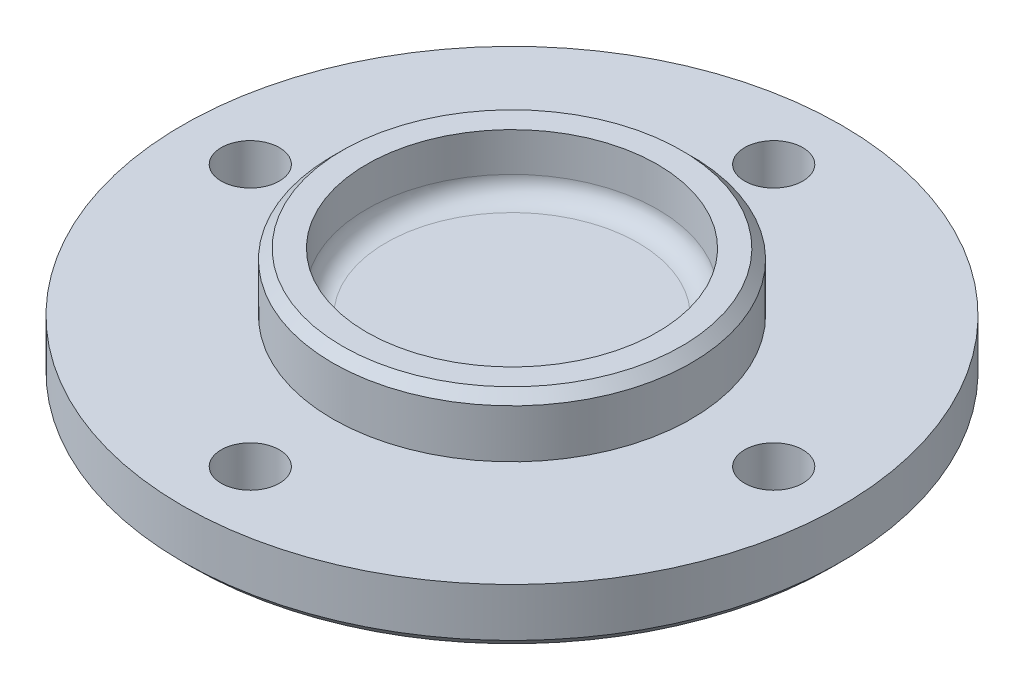
ISO-10303-21;
HEADER;
FILE_DESCRIPTION(('STEP AP214'),'2;1');
FILE_NAME('part.step','',(''),(''),'','','');
FILE_SCHEMA(('AUTOMOTIVE_DESIGN { 1 0 10303 214 1 1 1 1 }'));
ENDSEC;
DATA;
#1=APPLICATION_CONTEXT('core data for automotive mechanical design processes');
#2=APPLICATION_PROTOCOL_DEFINITION('international standard','automotive_design',2000,#1);
#3=PRODUCT_CONTEXT('',#1,'mechanical');
#4=PRODUCT('Part','Part','',(#3));
#5=PRODUCT_RELATED_PRODUCT_CATEGORY('part','',(#4));
#6=PRODUCT_DEFINITION_FORMATION('','',#4);
#7=PRODUCT_DEFINITION_CONTEXT('part definition',#1,'design');
#8=PRODUCT_DEFINITION('design','',#6,#7);
#9=PRODUCT_DEFINITION_SHAPE('','',#8);
#10=(LENGTH_UNIT() NAMED_UNIT(*) SI_UNIT(.MILLI.,.METRE.));
#11=(NAMED_UNIT(*) PLANE_ANGLE_UNIT() SI_UNIT($,.RADIAN.));
#12=(NAMED_UNIT(*) SI_UNIT($,.STERADIAN.) SOLID_ANGLE_UNIT());
#13=UNCERTAINTY_MEASURE_WITH_UNIT(LENGTH_MEASURE(1.E-05),#10,'distance_accuracy_value','');
#14=(GEOMETRIC_REPRESENTATION_CONTEXT(3) GLOBAL_UNCERTAINTY_ASSIGNED_CONTEXT((#13)) GLOBAL_UNIT_ASSIGNED_CONTEXT((#10,
#11,#12)) REPRESENTATION_CONTEXT('',''));
#15=CARTESIAN_POINT('',(0.,0.,0.));
#16=DIRECTION('',(0.,0.,1.));
#17=DIRECTION('',(1.,0.,0.));
#18=AXIS2_PLACEMENT_3D('',#15,#16,#17);
#19=CARTESIAN_POINT('',(0.,0.,0.));
#20=DIRECTION('',(0.,1.,0.));
#21=DIRECTION('',(0.,0.,1.));
#22=AXIS2_PLACEMENT_3D('',#19,#20,#21);
#23=PLANE('',#22);
#24=CARTESIAN_POINT('',(0.,0.,0.));
#25=DIRECTION('',(0.,1.,0.));
#26=DIRECTION('',(0.,0.,1.));
#27=AXIS2_PLACEMENT_3D('',#24,#25,#26);
#28=CIRCLE('',#27,33.);
#29=CARTESIAN_POINT('',(0.,0.,33.));
#30=VERTEX_POINT('',#29);
#31=EDGE_CURVE('E65',#30,#30,#28,.F.);
#32=ORIENTED_EDGE('',*,*,#31,.T.);
#33=EDGE_LOOP('',(#32));
#34=FACE_BOUND('',#33,.T.);
#35=CARTESIAN_POINT('',(27.,0.,0.));
#36=DIRECTION('',(0.,1.,0.));
#37=DIRECTION('',(-1.,0.,0.));
#38=AXIS2_PLACEMENT_3D('',#35,#36,#37);
#39=CIRCLE('',#38,3.);
#40=CARTESIAN_POINT('',(24.,0.,0.));
#41=VERTEX_POINT('',#40);
#42=EDGE_CURVE('E101',#41,#41,#39,.T.);
#43=ORIENTED_EDGE('',*,*,#42,.T.);
#44=EDGE_LOOP('',(#43));
#45=FACE_BOUND('',#44,.T.);
#46=CARTESIAN_POINT('',(0.,0.,27.));
#47=DIRECTION('',(0.,1.,0.));
#48=DIRECTION('',(0.,0.,-1.));
#49=AXIS2_PLACEMENT_3D('',#46,#47,#48);
#50=CIRCLE('',#49,3.);
#51=CARTESIAN_POINT('',(0.,0.,24.));
#52=VERTEX_POINT('',#51);
#53=EDGE_CURVE('E117',#52,#52,#50,.T.);
#54=ORIENTED_EDGE('',*,*,#53,.T.);
#55=EDGE_LOOP('',(#54));
#56=FACE_BOUND('',#55,.T.);
#57=CARTESIAN_POINT('',(-27.,0.,-2.82809988446294E-13));
#58=DIRECTION('',(0.,1.,0.));
#59=DIRECTION('',(1.,0.,0.));
#60=AXIS2_PLACEMENT_3D('',#57,#58,#59);
#61=CIRCLE('',#60,3.);
#62=CARTESIAN_POINT('',(-24.,0.,-2.51386656396706E-13));
#63=VERTEX_POINT('',#62);
#64=EDGE_CURVE('E109',#63,#63,#61,.T.);
#65=ORIENTED_EDGE('',*,*,#64,.T.);
#66=EDGE_LOOP('',(#65));
#67=FACE_BOUND('',#66,.T.);
#68=CARTESIAN_POINT('',(0.,0.,-27.));
#69=DIRECTION('',(0.,1.,0.));
#70=DIRECTION('',(0.,0.,1.));
#71=AXIS2_PLACEMENT_3D('',#68,#69,#70);
#72=CIRCLE('',#71,3.);
#73=CARTESIAN_POINT('',(0.,0.,-24.));
#74=VERTEX_POINT('',#73);
#75=EDGE_CURVE('E96',#74,#74,#72,.T.);
#76=ORIENTED_EDGE('',*,*,#75,.T.);
#77=EDGE_LOOP('',(#76));
#78=FACE_BOUND('',#77,.T.);
#79=ADVANCED_FACE('F51',(#34,#45,#56,#67,#78),#23,.F.);
#80=CARTESIAN_POINT('',(0.,6.,0.));
#81=DIRECTION('',(0.,-1.,0.));
#82=DIRECTION('',(0.,0.,-1.));
#83=AXIS2_PLACEMENT_3D('',#80,#81,#82);
#84=CYLINDRICAL_SURFACE('',#83,34.);
#85=CARTESIAN_POINT('',(0.,1.00000000000001,0.));
#86=DIRECTION('',(0.,1.,0.));
#87=DIRECTION('',(0.,0.,1.));
#88=AXIS2_PLACEMENT_3D('',#85,#86,#87);
#89=CIRCLE('',#88,34.);
#90=CARTESIAN_POINT('',(0.,1.00000000000001,34.));
#91=VERTEX_POINT('',#90);
#92=EDGE_CURVE('E70',#91,#91,#89,.T.);
#93=ORIENTED_EDGE('',*,*,#92,.T.);
#94=EDGE_LOOP('',(#93));
#95=FACE_BOUND('',#94,.T.);
#96=CARTESIAN_POINT('',(0.,6.,0.));
#97=DIRECTION('',(0.,1.,0.));
#98=DIRECTION('',(0.,0.,1.));
#99=AXIS2_PLACEMENT_3D('',#96,#97,#98);
#100=CIRCLE('',#99,34.);
#101=CARTESIAN_POINT('',(0.,6.,34.));
#102=VERTEX_POINT('',#101);
#103=EDGE_CURVE('E84',#102,#102,#100,.T.);
#104=ORIENTED_EDGE('',*,*,#103,.F.);
#105=EDGE_LOOP('',(#104));
#106=FACE_BOUND('',#105,.T.);
#107=ADVANCED_FACE('F143',(#95,#106),#84,.T.);
#108=CARTESIAN_POINT('',(0.,6.,0.));
#109=DIRECTION('',(0.,1.,0.));
#110=DIRECTION('',(0.,0.,1.));
#111=AXIS2_PLACEMENT_3D('',#108,#109,#110);
#112=PLANE('',#111);
#113=CARTESIAN_POINT('',(27.,6.,0.));
#114=DIRECTION('',(0.,1.,0.));
#115=DIRECTION('',(-1.,0.,0.));
#116=AXIS2_PLACEMENT_3D('',#113,#114,#115);
#117=CIRCLE('',#116,3.);
#118=CARTESIAN_POINT('',(24.,6.,0.));
#119=VERTEX_POINT('',#118);
#120=EDGE_CURVE('E121',#119,#119,#117,.T.);
#121=ORIENTED_EDGE('',*,*,#120,.F.);
#122=EDGE_LOOP('',(#121));
#123=FACE_BOUND('',#122,.T.);
#124=CARTESIAN_POINT('',(0.,6.,27.));
#125=DIRECTION('',(0.,1.,0.));
#126=DIRECTION('',(0.,0.,-1.));
#127=AXIS2_PLACEMENT_3D('',#124,#125,#126);
#128=CIRCLE('',#127,3.);
#129=CARTESIAN_POINT('',(0.,6.,24.));
#130=VERTEX_POINT('',#129);
#131=EDGE_CURVE('E113',#130,#130,#128,.T.);
#132=ORIENTED_EDGE('',*,*,#131,.F.);
#133=EDGE_LOOP('',(#132));
#134=FACE_BOUND('',#133,.T.);
#135=CARTESIAN_POINT('',(-27.,6.,-2.82809988446294E-13));
#136=DIRECTION('',(0.,1.,0.));
#137=DIRECTION('',(1.,0.,0.));
#138=AXIS2_PLACEMENT_3D('',#135,#136,#137);
#139=CIRCLE('',#138,3.);
#140=CARTESIAN_POINT('',(-24.,6.,-2.51386656396706E-13));
#141=VERTEX_POINT('',#140);
#142=EDGE_CURVE('E105',#141,#141,#139,.T.);
#143=ORIENTED_EDGE('',*,*,#142,.F.);
#144=EDGE_LOOP('',(#143));
#145=FACE_BOUND('',#144,.T.);
#146=CARTESIAN_POINT('',(0.,6.,-27.));
#147=DIRECTION('',(0.,1.,0.));
#148=DIRECTION('',(0.,0.,1.));
#149=AXIS2_PLACEMENT_3D('',#146,#147,#148);
#150=CIRCLE('',#149,3.);
#151=CARTESIAN_POINT('',(0.,6.,-24.));
#152=VERTEX_POINT('',#151);
#153=EDGE_CURVE('E97',#152,#152,#150,.T.);
#154=ORIENTED_EDGE('',*,*,#153,.F.);
#155=EDGE_LOOP('',(#154));
#156=FACE_BOUND('',#155,.T.);
#157=CARTESIAN_POINT('',(0.,6.,0.));
#158=DIRECTION('',(0.,1.,0.));
#159=DIRECTION('',(0.,0.,1.));
#160=AXIS2_PLACEMENT_3D('',#157,#158,#159);
#161=CIRCLE('',#160,18.5);
#162=CARTESIAN_POINT('',(0.,6.,18.5));
#163=VERTEX_POINT('',#162);
#164=EDGE_CURVE('E88',#163,#163,#161,.T.);
#165=ORIENTED_EDGE('',*,*,#164,.F.);
#166=EDGE_LOOP('',(#165));
#167=FACE_BOUND('',#166,.T.);
#168=ORIENTED_EDGE('',*,*,#103,.T.);
#169=EDGE_LOOP('',(#168));
#170=FACE_BOUND('',#169,.T.);
#171=ADVANCED_FACE('F139',(#123,#134,#145,#156,#167,#170),#112,.T.);
#172=CARTESIAN_POINT('',(0.,12.,0.));
#173=DIRECTION('',(0.,1.,0.));
#174=DIRECTION('',(0.,0.,1.));
#175=AXIS2_PLACEMENT_3D('',#172,#173,#174);
#176=PLANE('',#175);
#177=CARTESIAN_POINT('',(0.,12.,0.));
#178=DIRECTION('',(0.,1.,0.));
#179=DIRECTION('',(0.,0.,1.));
#180=AXIS2_PLACEMENT_3D('',#177,#178,#179);
#181=CIRCLE('',#180,17.5);
#182=CARTESIAN_POINT('',(0.,12.,17.5));
#183=VERTEX_POINT('',#182);
#184=EDGE_CURVE('E60',#183,#183,#181,.T.);
#185=ORIENTED_EDGE('',*,*,#184,.T.);
#186=EDGE_LOOP('',(#185));
#187=FACE_BOUND('',#186,.T.);
#188=CARTESIAN_POINT('',(0.,12.,0.));
#189=DIRECTION('',(0.,1.,0.));
#190=DIRECTION('',(0.,0.,1.));
#191=AXIS2_PLACEMENT_3D('',#188,#189,#190);
#192=CIRCLE('',#191,15.);
#193=CARTESIAN_POINT('',(0.,12.,15.));
#194=VERTEX_POINT('',#193);
#195=EDGE_CURVE('E92',#194,#194,#192,.T.);
#196=ORIENTED_EDGE('',*,*,#195,.F.);
#197=EDGE_LOOP('',(#196));
#198=FACE_BOUND('',#197,.T.);
#199=ADVANCED_FACE('F142',(#187,#198),#176,.T.);
#200=CARTESIAN_POINT('',(0.,12.,0.));
#201=DIRECTION('',(0.,-1.,0.));
#202=DIRECTION('',(0.,0.,-1.));
#203=AXIS2_PLACEMENT_3D('',#200,#201,#202);
#204=CYLINDRICAL_SURFACE('',#203,18.5);
#205=CARTESIAN_POINT('',(0.,11.,0.));
#206=DIRECTION('',(0.,1.,0.));
#207=DIRECTION('',(0.,0.,1.));
#208=AXIS2_PLACEMENT_3D('',#205,#206,#207);
#209=CIRCLE('',#208,18.5);
#210=CARTESIAN_POINT('',(0.,11.,18.5));
#211=VERTEX_POINT('',#210);
#212=EDGE_CURVE('E11',#211,#211,#209,.F.);
#213=ORIENTED_EDGE('',*,*,#212,.T.);
#214=EDGE_LOOP('',(#213));
#215=FACE_BOUND('',#214,.T.);
#216=ORIENTED_EDGE('',*,*,#164,.T.);
#217=EDGE_LOOP('',(#216));
#218=FACE_BOUND('',#217,.T.);
#219=ADVANCED_FACE('F195',(#215,#218),#204,.T.);
#220=CARTESIAN_POINT('',(0.,12.,0.));
#221=DIRECTION('',(0.,-1.,0.));
#222=DIRECTION('',(0.,0.,-1.));
#223=AXIS2_PLACEMENT_3D('',#220,#221,#222);
#224=CYLINDRICAL_SURFACE('',#223,15.);
#225=CARTESIAN_POINT('',(0.,8.,0.));
#226=DIRECTION('',(0.,1.,0.));
#227=DIRECTION('',(0.,0.,1.));
#228=AXIS2_PLACEMENT_3D('',#225,#226,#227);
#229=CIRCLE('',#228,15.);
#230=CARTESIAN_POINT('',(0.,8.,15.));
#231=VERTEX_POINT('',#230);
#232=EDGE_CURVE('E80',#231,#231,#229,.F.);
#233=ORIENTED_EDGE('',*,*,#232,.T.);
#234=EDGE_LOOP('',(#233));
#235=FACE_BOUND('',#234,.T.);
#236=ORIENTED_EDGE('',*,*,#195,.T.);
#237=EDGE_LOOP('',(#236));
#238=FACE_BOUND('',#237,.T.);
#239=ADVANCED_FACE('F200',(#235,#238),#224,.F.);
#240=CARTESIAN_POINT('',(0.,6.,0.));
#241=DIRECTION('',(0.,1.,0.));
#242=DIRECTION('',(0.,0.,1.));
#243=AXIS2_PLACEMENT_3D('',#240,#241,#242);
#244=CIRCLE('',#243,13.);
#245=CARTESIAN_POINT('',(0.,6.,13.));
#246=VERTEX_POINT('',#245);
#247=EDGE_CURVE('E76',#246,#246,#244,.T.);
#248=ORIENTED_EDGE('',*,*,#247,.T.);
#249=EDGE_LOOP('',(#248));
#250=FACE_BOUND('',#249,.T.);
#251=ADVANCED_FACE('F145',(#250),#112,.T.);
#252=CARTESIAN_POINT('',(0.,0.,-27.));
#253=DIRECTION('',(0.,1.,0.));
#254=DIRECTION('',(0.,0.,1.));
#255=AXIS2_PLACEMENT_3D('',#252,#253,#254);
#256=CYLINDRICAL_SURFACE('',#255,3.);
#257=ORIENTED_EDGE('',*,*,#75,.F.);
#258=EDGE_LOOP('',(#257));
#259=FACE_BOUND('',#258,.T.);
#260=ORIENTED_EDGE('',*,*,#153,.T.);
#261=EDGE_LOOP('',(#260));
#262=FACE_BOUND('',#261,.T.);
#263=ADVANCED_FACE('F242',(#259,#262),#256,.F.);
#264=CARTESIAN_POINT('',(-27.,0.,-2.82809988446294E-13));
#265=DIRECTION('',(0.,1.,0.));
#266=DIRECTION('',(0.,0.,1.));
#267=AXIS2_PLACEMENT_3D('',#264,#265,#266);
#268=CYLINDRICAL_SURFACE('',#267,3.);
#269=ORIENTED_EDGE('',*,*,#64,.F.);
#270=EDGE_LOOP('',(#269));
#271=FACE_BOUND('',#270,.T.);
#272=ORIENTED_EDGE('',*,*,#142,.T.);
#273=EDGE_LOOP('',(#272));
#274=FACE_BOUND('',#273,.T.);
#275=ADVANCED_FACE('F267',(#271,#274),#268,.F.);
#276=CARTESIAN_POINT('',(0.,0.,27.));
#277=DIRECTION('',(0.,1.,0.));
#278=DIRECTION('',(0.,0.,1.));
#279=AXIS2_PLACEMENT_3D('',#276,#277,#278);
#280=CYLINDRICAL_SURFACE('',#279,3.);
#281=ORIENTED_EDGE('',*,*,#53,.F.);
#282=EDGE_LOOP('',(#281));
#283=FACE_BOUND('',#282,.T.);
#284=ORIENTED_EDGE('',*,*,#131,.T.);
#285=EDGE_LOOP('',(#284));
#286=FACE_BOUND('',#285,.T.);
#287=ADVANCED_FACE('F135',(#283,#286),#280,.F.);
#288=CARTESIAN_POINT('',(27.,0.,0.));
#289=DIRECTION('',(0.,1.,0.));
#290=DIRECTION('',(0.,0.,1.));
#291=AXIS2_PLACEMENT_3D('',#288,#289,#290);
#292=CYLINDRICAL_SURFACE('',#291,3.);
#293=ORIENTED_EDGE('',*,*,#42,.F.);
#294=EDGE_LOOP('',(#293));
#295=FACE_BOUND('',#294,.T.);
#296=ORIENTED_EDGE('',*,*,#120,.T.);
#297=EDGE_LOOP('',(#296));
#298=FACE_BOUND('',#297,.T.);
#299=ADVANCED_FACE('F131',(#295,#298),#292,.F.);
#300=CARTESIAN_POINT('',(0.,8.,0.));
#301=DIRECTION('',(0.,1.,0.));
#302=DIRECTION('',(0.,0.,1.));
#303=AXIS2_PLACEMENT_3D('',#300,#301,#302);
#304=TOROIDAL_SURFACE('',#303,13.,2.);
#305=ORIENTED_EDGE('',*,*,#247,.F.);
#306=EDGE_LOOP('',(#305));
#307=FACE_BOUND('',#306,.T.);
#308=ORIENTED_EDGE('',*,*,#232,.F.);
#309=EDGE_LOOP('',(#308));
#310=FACE_BOUND('',#309,.T.);
#311=ADVANCED_FACE('F134',(#307,#310),#304,.F.);
#312=CARTESIAN_POINT('',(0.,1.00000000000001,0.));
#313=DIRECTION('',(0.,1.,0.));
#314=DIRECTION('',(0.,0.,1.));
#315=AXIS2_PLACEMENT_3D('',#312,#313,#314);
#316=CONICAL_SURFACE('',#315,34.,0.785398163397448);
#317=ORIENTED_EDGE('',*,*,#31,.F.);
#318=EDGE_LOOP('',(#317));
#319=FACE_BOUND('',#318,.T.);
#320=ORIENTED_EDGE('',*,*,#92,.F.);
#321=EDGE_LOOP('',(#320));
#322=FACE_BOUND('',#321,.T.);
#323=ADVANCED_FACE('F166',(#319,#322),#316,.T.);
#324=CARTESIAN_POINT('',(0.,12.,0.));
#325=DIRECTION('',(0.,-1.,0.));
#326=DIRECTION('',(0.,0.,-1.));
#327=AXIS2_PLACEMENT_3D('',#324,#325,#326);
#328=CONICAL_SURFACE('',#327,17.5,0.78539816339745);
#329=ORIENTED_EDGE('',*,*,#212,.F.);
#330=EDGE_LOOP('',(#329));
#331=FACE_BOUND('',#330,.T.);
#332=ORIENTED_EDGE('',*,*,#184,.F.);
#333=EDGE_LOOP('',(#332));
#334=FACE_BOUND('',#333,.T.);
#335=ADVANCED_FACE('F54',(#331,#334),#328,.T.);
#336=CLOSED_SHELL('',(#79,#107,#171,#199,#219,#239,#251,#263,#275,#287,#299,#311,#323,#335));
#337=MANIFOLD_SOLID_BREP('B2',#336);
#338=ADVANCED_BREP_SHAPE_REPRESENTATION('',(#18,#337),#14);
#339=SHAPE_DEFINITION_REPRESENTATION(#9,#338);
ENDSEC;
END-ISO-10303-21;
